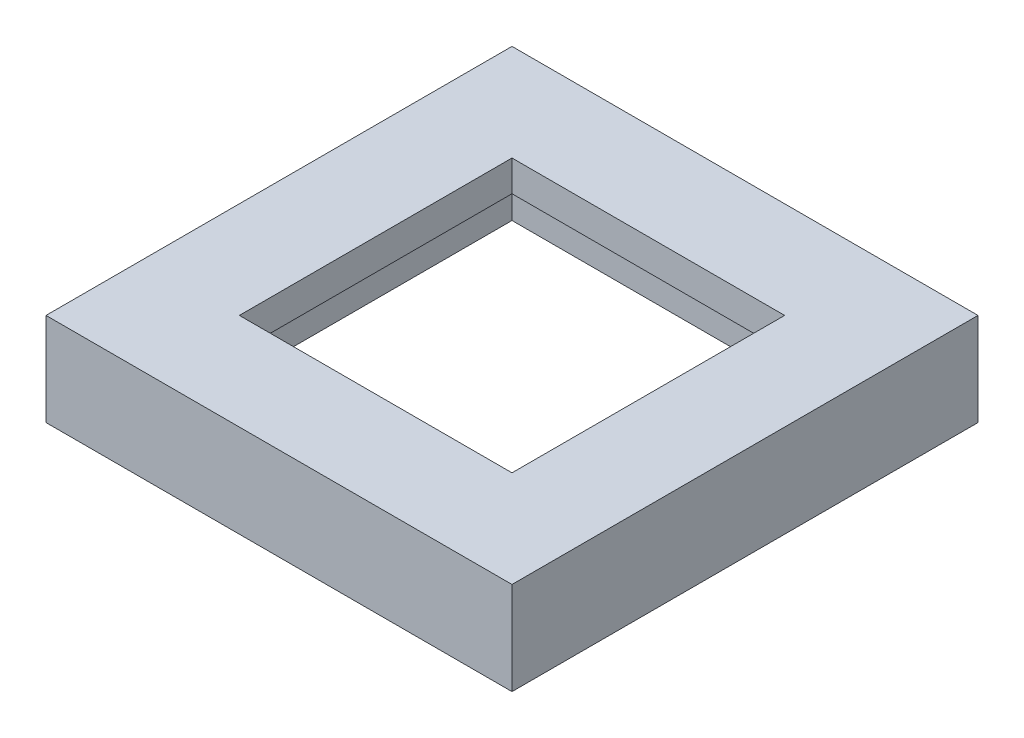
ISO-10303-21;
HEADER;
FILE_DESCRIPTION(('STEP AP214'),'2;1');
FILE_NAME('part.step','',(''),(''),'','','');
FILE_SCHEMA(('AUTOMOTIVE_DESIGN { 1 0 10303 214 1 1 1 1 }'));
ENDSEC;
DATA;
#1=APPLICATION_CONTEXT('core data for automotive mechanical design processes');
#2=APPLICATION_PROTOCOL_DEFINITION('international standard','automotive_design',2000,#1);
#3=PRODUCT_CONTEXT('',#1,'mechanical');
#4=PRODUCT('Part','Part','',(#3));
#5=PRODUCT_RELATED_PRODUCT_CATEGORY('part','',(#4));
#6=PRODUCT_DEFINITION_FORMATION('','',#4);
#7=PRODUCT_DEFINITION_CONTEXT('part definition',#1,'design');
#8=PRODUCT_DEFINITION('design','',#6,#7);
#9=PRODUCT_DEFINITION_SHAPE('','',#8);
#10=(LENGTH_UNIT() NAMED_UNIT(*) SI_UNIT(.MILLI.,.METRE.));
#11=(NAMED_UNIT(*) PLANE_ANGLE_UNIT() SI_UNIT($,.RADIAN.));
#12=(NAMED_UNIT(*) SI_UNIT($,.STERADIAN.) SOLID_ANGLE_UNIT());
#13=UNCERTAINTY_MEASURE_WITH_UNIT(LENGTH_MEASURE(1.E-05),#10,'distance_accuracy_value','');
#14=(GEOMETRIC_REPRESENTATION_CONTEXT(3) GLOBAL_UNCERTAINTY_ASSIGNED_CONTEXT((#13)) GLOBAL_UNIT_ASSIGNED_CONTEXT((#10,
#11,#12)) REPRESENTATION_CONTEXT('',''));
#15=CARTESIAN_POINT('',(0.,0.,0.));
#16=DIRECTION('',(0.,0.,1.));
#17=DIRECTION('',(1.,0.,0.));
#18=AXIS2_PLACEMENT_3D('',#15,#16,#17);
#19=CARTESIAN_POINT('',(0.,-4.8,0.));
#20=DIRECTION('',(0.,1.,0.));
#21=DIRECTION('',(1.,0.,0.));
#22=AXIS2_PLACEMENT_3D('',#19,#20,#21);
#23=PLANE('',#22);
#24=DIRECTION('',(1.,0.,0.));
#25=VECTOR('',#24,1.);
#26=CARTESIAN_POINT('',(0.,-4.8,-9.05));
#27=LINE('',#26,#25);
#28=CARTESIAN_POINT('',(-9.05,-4.8,-9.05));
#29=VERTEX_POINT('',#28);
#30=CARTESIAN_POINT('',(9.05,-4.8,-9.05));
#31=VERTEX_POINT('',#30);
#32=EDGE_CURVE('E110',#29,#31,#27,.T.);
#33=ORIENTED_EDGE('',*,*,#32,.F.);
#34=DIRECTION('',(0.,0.,1.));
#35=VECTOR('',#34,1.);
#36=CARTESIAN_POINT('',(-9.05,-4.8,0.));
#37=LINE('',#36,#35);
#38=CARTESIAN_POINT('',(-9.05,-4.8,9.05));
#39=VERTEX_POINT('',#38);
#40=EDGE_CURVE('E143',#29,#39,#37,.T.);
#41=ORIENTED_EDGE('',*,*,#40,.T.);
#42=DIRECTION('',(1.,0.,0.));
#43=VECTOR('',#42,1.);
#44=CARTESIAN_POINT('',(0.,-4.8,9.05));
#45=LINE('',#44,#43);
#46=CARTESIAN_POINT('',(9.05,-4.8,9.05));
#47=VERTEX_POINT('',#46);
#48=EDGE_CURVE('E98',#39,#47,#45,.T.);
#49=ORIENTED_EDGE('',*,*,#48,.T.);
#50=DIRECTION('',(0.,0.,1.));
#51=VECTOR('',#50,1.);
#52=CARTESIAN_POINT('',(9.05,-4.8,0.));
#53=LINE('',#52,#51);
#54=EDGE_CURVE('E106',#31,#47,#53,.T.);
#55=ORIENTED_EDGE('',*,*,#54,.F.);
#56=EDGE_LOOP('',(#33,#41,#49,#55));
#57=FACE_BOUND('',#56,.T.);
#58=DIRECTION('',(0.,0.,1.));
#59=VECTOR('',#58,1.);
#60=CARTESIAN_POINT('',(12.05,-4.8,0.));
#61=LINE('',#60,#59);
#62=CARTESIAN_POINT('',(12.05,-4.8,-12.05));
#63=VERTEX_POINT('',#62);
#64=CARTESIAN_POINT('',(12.05,-4.8,12.05));
#65=VERTEX_POINT('',#64);
#66=EDGE_CURVE('E166',#63,#65,#61,.T.);
#67=ORIENTED_EDGE('',*,*,#66,.T.);
#68=DIRECTION('',(1.,0.,0.));
#69=VECTOR('',#68,1.);
#70=CARTESIAN_POINT('',(0.,-4.8,12.05));
#71=LINE('',#70,#69);
#72=CARTESIAN_POINT('',(-12.05,-4.8,12.05));
#73=VERTEX_POINT('',#72);
#74=EDGE_CURVE('E236',#73,#65,#71,.T.);
#75=ORIENTED_EDGE('',*,*,#74,.F.);
#76=DIRECTION('',(0.,0.,1.));
#77=VECTOR('',#76,1.);
#78=CARTESIAN_POINT('',(-12.05,-4.8,0.));
#79=LINE('',#78,#77);
#80=CARTESIAN_POINT('',(-12.05,-4.8,-12.05));
#81=VERTEX_POINT('',#80);
#82=EDGE_CURVE('E27',#81,#73,#79,.T.);
#83=ORIENTED_EDGE('',*,*,#82,.F.);
#84=DIRECTION('',(1.,0.,0.));
#85=VECTOR('',#84,1.);
#86=CARTESIAN_POINT('',(0.,-4.8,-12.05));
#87=LINE('',#86,#85);
#88=EDGE_CURVE('E11',#81,#63,#87,.T.);
#89=ORIENTED_EDGE('',*,*,#88,.T.);
#90=EDGE_LOOP('',(#67,#75,#83,#89));
#91=FACE_BOUND('',#90,.T.);
#92=ADVANCED_FACE('F16',(#57,#91),#23,.F.);
#93=CARTESIAN_POINT('',(0.,-4.8,-12.05));
#94=DIRECTION('',(0.,0.,1.));
#95=DIRECTION('',(1.,0.,0.));
#96=AXIS2_PLACEMENT_3D('',#93,#94,#95);
#97=PLANE('',#96);
#98=DIRECTION('',(1.,0.,0.));
#99=VECTOR('',#98,1.);
#100=CARTESIAN_POINT('',(0.,0.,-12.05));
#101=LINE('',#100,#99);
#102=CARTESIAN_POINT('',(-12.05,0.,-12.05));
#103=VERTEX_POINT('',#102);
#104=CARTESIAN_POINT('',(12.05,0.,-12.05));
#105=VERTEX_POINT('',#104);
#106=EDGE_CURVE('E163',#103,#105,#101,.T.);
#107=ORIENTED_EDGE('',*,*,#106,.T.);
#108=DIRECTION('',(0.,1.,0.));
#109=VECTOR('',#108,1.);
#110=CARTESIAN_POINT('',(12.05,-4.8,-12.05));
#111=LINE('',#110,#109);
#112=EDGE_CURVE('E170',#63,#105,#111,.T.);
#113=ORIENTED_EDGE('',*,*,#112,.F.);
#114=ORIENTED_EDGE('',*,*,#88,.F.);
#115=DIRECTION('',(0.,1.,0.));
#116=VECTOR('',#115,1.);
#117=CARTESIAN_POINT('',(-12.05,-4.8,-12.05));
#118=LINE('',#117,#116);
#119=EDGE_CURVE('E173',#81,#103,#118,.T.);
#120=ORIENTED_EDGE('',*,*,#119,.T.);
#121=EDGE_LOOP('',(#107,#113,#114,#120));
#122=FACE_BOUND('',#121,.T.);
#123=ADVANCED_FACE('F273',(#122),#97,.F.);
#124=CARTESIAN_POINT('',(-12.05,-4.8,0.));
#125=DIRECTION('',(-1.,0.,0.));
#126=DIRECTION('',(0.,0.,1.));
#127=AXIS2_PLACEMENT_3D('',#124,#125,#126);
#128=PLANE('',#127);
#129=DIRECTION('',(0.,0.,1.));
#130=VECTOR('',#129,1.);
#131=CARTESIAN_POINT('',(-12.05,0.,0.));
#132=LINE('',#131,#130);
#133=CARTESIAN_POINT('',(-12.05,0.,12.05));
#134=VERTEX_POINT('',#133);
#135=EDGE_CURVE('E177',#103,#134,#132,.T.);
#136=ORIENTED_EDGE('',*,*,#135,.F.);
#137=ORIENTED_EDGE('',*,*,#119,.F.);
#138=ORIENTED_EDGE('',*,*,#82,.T.);
#139=DIRECTION('',(0.,1.,0.));
#140=VECTOR('',#139,1.);
#141=CARTESIAN_POINT('',(-12.05,-4.8,12.05));
#142=LINE('',#141,#140);
#143=EDGE_CURVE('E230',#73,#134,#142,.T.);
#144=ORIENTED_EDGE('',*,*,#143,.T.);
#145=EDGE_LOOP('',(#136,#137,#138,#144));
#146=FACE_BOUND('',#145,.T.);
#147=ADVANCED_FACE('F276',(#146),#128,.T.);
#148=CARTESIAN_POINT('',(0.,-4.8,12.05));
#149=DIRECTION('',(0.,0.,1.));
#150=DIRECTION('',(1.,0.,0.));
#151=AXIS2_PLACEMENT_3D('',#148,#149,#150);
#152=PLANE('',#151);
#153=DIRECTION('',(1.,0.,0.));
#154=VECTOR('',#153,1.);
#155=CARTESIAN_POINT('',(0.,0.,12.05));
#156=LINE('',#155,#154);
#157=CARTESIAN_POINT('',(12.05,0.,12.05));
#158=VERTEX_POINT('',#157);
#159=EDGE_CURVE('E135',#134,#158,#156,.T.);
#160=ORIENTED_EDGE('',*,*,#159,.F.);
#161=ORIENTED_EDGE('',*,*,#143,.F.);
#162=ORIENTED_EDGE('',*,*,#74,.T.);
#163=DIRECTION('',(0.,1.,0.));
#164=VECTOR('',#163,1.);
#165=CARTESIAN_POINT('',(12.05,-4.8,12.05));
#166=LINE('',#165,#164);
#167=EDGE_CURVE('E114',#65,#158,#166,.T.);
#168=ORIENTED_EDGE('',*,*,#167,.T.);
#169=EDGE_LOOP('',(#160,#161,#162,#168));
#170=FACE_BOUND('',#169,.T.);
#171=ADVANCED_FACE('F259',(#170),#152,.T.);
#172=CARTESIAN_POINT('',(12.05,-4.8,0.));
#173=DIRECTION('',(-1.,0.,0.));
#174=DIRECTION('',(0.,0.,1.));
#175=AXIS2_PLACEMENT_3D('',#172,#173,#174);
#176=PLANE('',#175);
#177=DIRECTION('',(0.,0.,1.));
#178=VECTOR('',#177,1.);
#179=CARTESIAN_POINT('',(12.05,0.,0.));
#180=LINE('',#179,#178);
#181=EDGE_CURVE('E160',#105,#158,#180,.T.);
#182=ORIENTED_EDGE('',*,*,#181,.T.);
#183=ORIENTED_EDGE('',*,*,#167,.F.);
#184=ORIENTED_EDGE('',*,*,#66,.F.);
#185=ORIENTED_EDGE('',*,*,#112,.T.);
#186=EDGE_LOOP('',(#182,#183,#184,#185));
#187=FACE_BOUND('',#186,.T.);
#188=ADVANCED_FACE('F271',(#187),#176,.F.);
#189=CARTESIAN_POINT('',(9.05,-4.8,0.));
#190=DIRECTION('',(-1.,0.,0.));
#191=DIRECTION('',(0.,0.,1.));
#192=AXIS2_PLACEMENT_3D('',#189,#190,#191);
#193=PLANE('',#192);
#194=DIRECTION('',(0.,0.,1.));
#195=VECTOR('',#194,1.);
#196=CARTESIAN_POINT('',(9.05,-1.6,0.));
#197=LINE('',#196,#195);
#198=CARTESIAN_POINT('',(9.05,-1.6,-9.05));
#199=VERTEX_POINT('',#198);
#200=CARTESIAN_POINT('',(9.05,-1.6,9.05));
#201=VERTEX_POINT('',#200);
#202=EDGE_CURVE('E121',#199,#201,#197,.T.);
#203=ORIENTED_EDGE('',*,*,#202,.F.);
#204=DIRECTION('',(0.,1.,0.));
#205=VECTOR('',#204,1.);
#206=CARTESIAN_POINT('',(9.05,-4.8,-9.05));
#207=LINE('',#206,#205);
#208=EDGE_CURVE('E118',#31,#199,#207,.T.);
#209=ORIENTED_EDGE('',*,*,#208,.F.);
#210=ORIENTED_EDGE('',*,*,#54,.T.);
#211=DIRECTION('',(0.,1.,0.));
#212=VECTOR('',#211,1.);
#213=CARTESIAN_POINT('',(9.05,-4.8,9.05));
#214=LINE('',#213,#212);
#215=EDGE_CURVE('E146',#47,#201,#214,.T.);
#216=ORIENTED_EDGE('',*,*,#215,.T.);
#217=EDGE_LOOP('',(#203,#209,#210,#216));
#218=FACE_BOUND('',#217,.T.);
#219=ADVANCED_FACE('F119',(#218),#193,.T.);
#220=CARTESIAN_POINT('',(0.,-4.8,9.05));
#221=DIRECTION('',(0.,0.,1.));
#222=DIRECTION('',(1.,0.,0.));
#223=AXIS2_PLACEMENT_3D('',#220,#221,#222);
#224=PLANE('',#223);
#225=DIRECTION('',(0.,1.,0.));
#226=VECTOR('',#225,1.);
#227=CARTESIAN_POINT('',(-9.05,-4.8,9.05));
#228=LINE('',#227,#226);
#229=CARTESIAN_POINT('',(-9.05,-1.6,9.05));
#230=VERTEX_POINT('',#229);
#231=EDGE_CURVE('E126',#39,#230,#228,.T.);
#232=ORIENTED_EDGE('',*,*,#231,.T.);
#233=DIRECTION('',(1.,0.,0.));
#234=VECTOR('',#233,1.);
#235=CARTESIAN_POINT('',(0.,-1.6,9.05));
#236=LINE('',#235,#234);
#237=EDGE_CURVE('E192',#230,#201,#236,.T.);
#238=ORIENTED_EDGE('',*,*,#237,.T.);
#239=ORIENTED_EDGE('',*,*,#215,.F.);
#240=ORIENTED_EDGE('',*,*,#48,.F.);
#241=EDGE_LOOP('',(#232,#238,#239,#240));
#242=FACE_BOUND('',#241,.T.);
#243=ADVANCED_FACE('F207',(#242),#224,.F.);
#244=CARTESIAN_POINT('',(-9.05,-4.8,0.));
#245=DIRECTION('',(-1.,0.,0.));
#246=DIRECTION('',(0.,0.,1.));
#247=AXIS2_PLACEMENT_3D('',#244,#245,#246);
#248=PLANE('',#247);
#249=DIRECTION('',(0.,1.,0.));
#250=VECTOR('',#249,1.);
#251=CARTESIAN_POINT('',(-9.05,-4.8,-9.05));
#252=LINE('',#251,#250);
#253=CARTESIAN_POINT('',(-9.05,-1.6,-9.05));
#254=VERTEX_POINT('',#253);
#255=EDGE_CURVE('E20',#29,#254,#252,.T.);
#256=ORIENTED_EDGE('',*,*,#255,.T.);
#257=DIRECTION('',(0.,0.,1.));
#258=VECTOR('',#257,1.);
#259=CARTESIAN_POINT('',(-9.05,-1.6,0.));
#260=LINE('',#259,#258);
#261=EDGE_CURVE('E182',#254,#230,#260,.T.);
#262=ORIENTED_EDGE('',*,*,#261,.T.);
#263=ORIENTED_EDGE('',*,*,#231,.F.);
#264=ORIENTED_EDGE('',*,*,#40,.F.);
#265=EDGE_LOOP('',(#256,#262,#263,#264));
#266=FACE_BOUND('',#265,.T.);
#267=ADVANCED_FACE('F203',(#266),#248,.F.);
#268=CARTESIAN_POINT('',(0.,-4.8,-9.05));
#269=DIRECTION('',(0.,0.,1.));
#270=DIRECTION('',(1.,0.,0.));
#271=AXIS2_PLACEMENT_3D('',#268,#269,#270);
#272=PLANE('',#271);
#273=DIRECTION('',(1.,0.,0.));
#274=VECTOR('',#273,1.);
#275=CARTESIAN_POINT('',(0.,-1.6,-9.05));
#276=LINE('',#275,#274);
#277=EDGE_CURVE('E164',#254,#199,#276,.T.);
#278=ORIENTED_EDGE('',*,*,#277,.F.);
#279=ORIENTED_EDGE('',*,*,#255,.F.);
#280=ORIENTED_EDGE('',*,*,#32,.T.);
#281=ORIENTED_EDGE('',*,*,#208,.T.);
#282=EDGE_LOOP('',(#278,#279,#280,#281));
#283=FACE_BOUND('',#282,.T.);
#284=ADVANCED_FACE('F128',(#283),#272,.T.);
#285=CARTESIAN_POINT('',(0.,0.,0.));
#286=DIRECTION('',(0.,1.,0.));
#287=DIRECTION('',(1.,0.,0.));
#288=AXIS2_PLACEMENT_3D('',#285,#286,#287);
#289=PLANE('',#288);
#290=DIRECTION('',(1.,0.,0.));
#291=VECTOR('',#290,1.);
#292=CARTESIAN_POINT('',(0.,0.,-7.05));
#293=LINE('',#292,#291);
#294=CARTESIAN_POINT('',(-7.05,0.,-7.05));
#295=VERTEX_POINT('',#294);
#296=CARTESIAN_POINT('',(7.05,0.,-7.05));
#297=VERTEX_POINT('',#296);
#298=EDGE_CURVE('E147',#295,#297,#293,.T.);
#299=ORIENTED_EDGE('',*,*,#298,.T.);
#300=DIRECTION('',(0.,0.,1.));
#301=VECTOR('',#300,1.);
#302=CARTESIAN_POINT('',(7.05,0.,0.));
#303=LINE('',#302,#301);
#304=CARTESIAN_POINT('',(7.05,0.,7.05));
#305=VERTEX_POINT('',#304);
#306=EDGE_CURVE('E159',#297,#305,#303,.T.);
#307=ORIENTED_EDGE('',*,*,#306,.T.);
#308=DIRECTION('',(1.,0.,0.));
#309=VECTOR('',#308,1.);
#310=CARTESIAN_POINT('',(0.,0.,7.05));
#311=LINE('',#310,#309);
#312=CARTESIAN_POINT('',(-7.05,0.,7.05));
#313=VERTEX_POINT('',#312);
#314=EDGE_CURVE('E155',#313,#305,#311,.T.);
#315=ORIENTED_EDGE('',*,*,#314,.F.);
#316=DIRECTION('',(0.,0.,1.));
#317=VECTOR('',#316,1.);
#318=CARTESIAN_POINT('',(-7.05,0.,0.));
#319=LINE('',#318,#317);
#320=EDGE_CURVE('E142',#295,#313,#319,.T.);
#321=ORIENTED_EDGE('',*,*,#320,.F.);
#322=EDGE_LOOP('',(#299,#307,#315,#321));
#323=FACE_BOUND('',#322,.T.);
#324=ORIENTED_EDGE('',*,*,#181,.F.);
#325=ORIENTED_EDGE('',*,*,#106,.F.);
#326=ORIENTED_EDGE('',*,*,#135,.T.);
#327=ORIENTED_EDGE('',*,*,#159,.T.);
#328=EDGE_LOOP('',(#324,#325,#326,#327));
#329=FACE_BOUND('',#328,.T.);
#330=ADVANCED_FACE('F268',(#323,#329),#289,.T.);
#331=CARTESIAN_POINT('',(0.,-1.6,0.));
#332=DIRECTION('',(0.,1.,0.));
#333=DIRECTION('',(1.,0.,0.));
#334=AXIS2_PLACEMENT_3D('',#331,#332,#333);
#335=PLANE('',#334);
#336=DIRECTION('',(1.,0.,0.));
#337=VECTOR('',#336,1.);
#338=CARTESIAN_POINT('',(0.,-1.6,-7.05));
#339=LINE('',#338,#337);
#340=CARTESIAN_POINT('',(-7.05,-1.6,-7.05));
#341=VERTEX_POINT('',#340);
#342=CARTESIAN_POINT('',(7.05,-1.6,-7.05));
#343=VERTEX_POINT('',#342);
#344=EDGE_CURVE('E183',#341,#343,#339,.T.);
#345=ORIENTED_EDGE('',*,*,#344,.F.);
#346=DIRECTION('',(0.,0.,1.));
#347=VECTOR('',#346,1.);
#348=CARTESIAN_POINT('',(-7.05,-1.6,0.));
#349=LINE('',#348,#347);
#350=CARTESIAN_POINT('',(-7.05,-1.6,7.05));
#351=VERTEX_POINT('',#350);
#352=EDGE_CURVE('E141',#341,#351,#349,.T.);
#353=ORIENTED_EDGE('',*,*,#352,.T.);
#354=DIRECTION('',(1.,0.,0.));
#355=VECTOR('',#354,1.);
#356=CARTESIAN_POINT('',(0.,-1.6,7.05));
#357=LINE('',#356,#355);
#358=CARTESIAN_POINT('',(7.05,-1.6,7.05));
#359=VERTEX_POINT('',#358);
#360=EDGE_CURVE('E215',#351,#359,#357,.T.);
#361=ORIENTED_EDGE('',*,*,#360,.T.);
#362=DIRECTION('',(0.,0.,1.));
#363=VECTOR('',#362,1.);
#364=CARTESIAN_POINT('',(7.05,-1.6,0.));
#365=LINE('',#364,#363);
#366=EDGE_CURVE('E156',#343,#359,#365,.T.);
#367=ORIENTED_EDGE('',*,*,#366,.F.);
#368=EDGE_LOOP('',(#345,#353,#361,#367));
#369=FACE_BOUND('',#368,.T.);
#370=ORIENTED_EDGE('',*,*,#202,.T.);
#371=ORIENTED_EDGE('',*,*,#237,.F.);
#372=ORIENTED_EDGE('',*,*,#261,.F.);
#373=ORIENTED_EDGE('',*,*,#277,.T.);
#374=EDGE_LOOP('',(#370,#371,#372,#373));
#375=FACE_BOUND('',#374,.T.);
#376=ADVANCED_FACE('F18',(#369,#375),#335,.F.);
#377=CARTESIAN_POINT('',(7.05,-1.6,0.));
#378=DIRECTION('',(-1.,0.,0.));
#379=DIRECTION('',(0.,0.,1.));
#380=AXIS2_PLACEMENT_3D('',#377,#378,#379);
#381=PLANE('',#380);
#382=ORIENTED_EDGE('',*,*,#306,.F.);
#383=DIRECTION('',(0.,1.,0.));
#384=VECTOR('',#383,1.);
#385=CARTESIAN_POINT('',(7.05,-1.6,-7.05));
#386=LINE('',#385,#384);
#387=EDGE_CURVE('E187',#343,#297,#386,.T.);
#388=ORIENTED_EDGE('',*,*,#387,.F.);
#389=ORIENTED_EDGE('',*,*,#366,.T.);
#390=DIRECTION('',(0.,1.,0.));
#391=VECTOR('',#390,1.);
#392=CARTESIAN_POINT('',(7.05,-1.6,7.05));
#393=LINE('',#392,#391);
#394=EDGE_CURVE('E191',#359,#305,#393,.T.);
#395=ORIENTED_EDGE('',*,*,#394,.T.);
#396=EDGE_LOOP('',(#382,#388,#389,#395));
#397=FACE_BOUND('',#396,.T.);
#398=ADVANCED_FACE('F317',(#397),#381,.T.);
#399=CARTESIAN_POINT('',(0.,-1.6,7.05));
#400=DIRECTION('',(0.,0.,1.));
#401=DIRECTION('',(1.,0.,0.));
#402=AXIS2_PLACEMENT_3D('',#399,#400,#401);
#403=PLANE('',#402);
#404=ORIENTED_EDGE('',*,*,#314,.T.);
#405=ORIENTED_EDGE('',*,*,#394,.F.);
#406=ORIENTED_EDGE('',*,*,#360,.F.);
#407=DIRECTION('',(0.,1.,0.));
#408=VECTOR('',#407,1.);
#409=CARTESIAN_POINT('',(-7.05,-1.6,7.05));
#410=LINE('',#409,#408);
#411=EDGE_CURVE('E138',#351,#313,#410,.T.);
#412=ORIENTED_EDGE('',*,*,#411,.T.);
#413=EDGE_LOOP('',(#404,#405,#406,#412));
#414=FACE_BOUND('',#413,.T.);
#415=ADVANCED_FACE('F324',(#414),#403,.F.);
#416=CARTESIAN_POINT('',(-7.05,-1.6,0.));
#417=DIRECTION('',(-1.,0.,0.));
#418=DIRECTION('',(0.,0.,1.));
#419=AXIS2_PLACEMENT_3D('',#416,#417,#418);
#420=PLANE('',#419);
#421=ORIENTED_EDGE('',*,*,#320,.T.);
#422=ORIENTED_EDGE('',*,*,#411,.F.);
#423=ORIENTED_EDGE('',*,*,#352,.F.);
#424=DIRECTION('',(0.,1.,0.));
#425=VECTOR('',#424,1.);
#426=CARTESIAN_POINT('',(-7.05,-1.6,-7.05));
#427=LINE('',#426,#425);
#428=EDGE_CURVE('E151',#341,#295,#427,.T.);
#429=ORIENTED_EDGE('',*,*,#428,.T.);
#430=EDGE_LOOP('',(#421,#422,#423,#429));
#431=FACE_BOUND('',#430,.T.);
#432=ADVANCED_FACE('F322',(#431),#420,.F.);
#433=CARTESIAN_POINT('',(0.,-1.6,-7.05));
#434=DIRECTION('',(0.,0.,1.));
#435=DIRECTION('',(1.,0.,0.));
#436=AXIS2_PLACEMENT_3D('',#433,#434,#435);
#437=PLANE('',#436);
#438=ORIENTED_EDGE('',*,*,#298,.F.);
#439=ORIENTED_EDGE('',*,*,#428,.F.);
#440=ORIENTED_EDGE('',*,*,#344,.T.);
#441=ORIENTED_EDGE('',*,*,#387,.T.);
#442=EDGE_LOOP('',(#438,#439,#440,#441));
#443=FACE_BOUND('',#442,.T.);
#444=ADVANCED_FACE('F320',(#443),#437,.T.);
#445=CLOSED_SHELL('',(#92,#123,#147,#171,#188,#219,#243,#267,#284,#330,#376,#398,#415,#432,#444));
#446=MANIFOLD_SOLID_BREP('B1',#445);
#447=ADVANCED_BREP_SHAPE_REPRESENTATION('',(#18,#446),#14);
#448=SHAPE_DEFINITION_REPRESENTATION(#9,#447);
ENDSEC;
END-ISO-10303-21;
